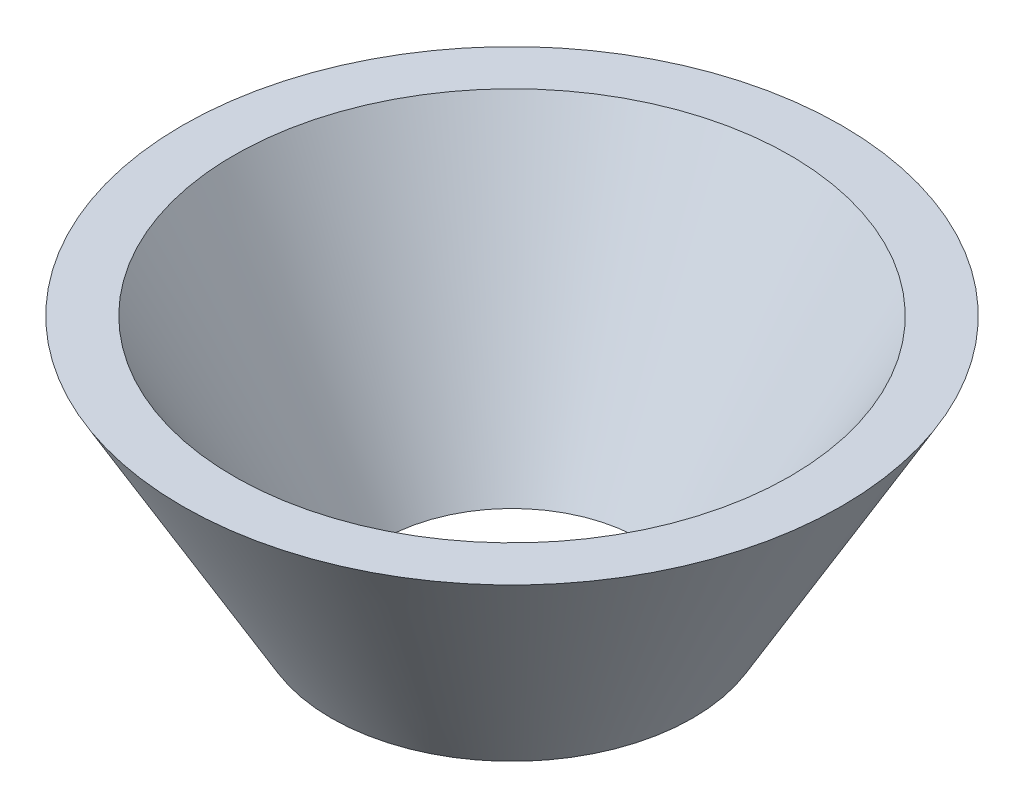
ISO-10303-21;
HEADER;
FILE_DESCRIPTION(('STEP AP214'),'2;1');
FILE_NAME('part.step','',(''),(''),'','','');
FILE_SCHEMA(('AUTOMOTIVE_DESIGN { 1 0 10303 214 1 1 1 1 }'));
ENDSEC;
DATA;
#1=APPLICATION_CONTEXT('core data for automotive mechanical design processes');
#2=APPLICATION_PROTOCOL_DEFINITION('international standard','automotive_design',2000,#1);
#3=PRODUCT_CONTEXT('',#1,'mechanical');
#4=PRODUCT('Part','Part','',(#3));
#5=PRODUCT_RELATED_PRODUCT_CATEGORY('part','',(#4));
#6=PRODUCT_DEFINITION_FORMATION('','',#4);
#7=PRODUCT_DEFINITION_CONTEXT('part definition',#1,'design');
#8=PRODUCT_DEFINITION('design','',#6,#7);
#9=PRODUCT_DEFINITION_SHAPE('','',#8);
#10=(LENGTH_UNIT() NAMED_UNIT(*) SI_UNIT(.MILLI.,.METRE.));
#11=(NAMED_UNIT(*) PLANE_ANGLE_UNIT() SI_UNIT($,.RADIAN.));
#12=(NAMED_UNIT(*) SI_UNIT($,.STERADIAN.) SOLID_ANGLE_UNIT());
#13=UNCERTAINTY_MEASURE_WITH_UNIT(LENGTH_MEASURE(1.E-05),#10,'distance_accuracy_value','');
#14=(GEOMETRIC_REPRESENTATION_CONTEXT(3) GLOBAL_UNCERTAINTY_ASSIGNED_CONTEXT((#13)) GLOBAL_UNIT_ASSIGNED_CONTEXT((#10,
#11,#12)) REPRESENTATION_CONTEXT('',''));
#15=CARTESIAN_POINT('',(0.,0.,0.));
#16=DIRECTION('',(0.,0.,1.));
#17=DIRECTION('',(1.,0.,0.));
#18=AXIS2_PLACEMENT_3D('',#15,#16,#17);
#19=CARTESIAN_POINT('',(-53.8675134594811,50.,0.));
#20=DIRECTION('',(0.,-1.,0.));
#21=DIRECTION('',(1.,0.,0.));
#22=AXIS2_PLACEMENT_3D('',#19,#20,#21);
#23=PLANE('',#22);
#24=CARTESIAN_POINT('',(-1.71454689373137E-13,50.0000000000002,0.));
#25=DIRECTION('',(0.,-1.,0.));
#26=DIRECTION('',(1.,0.,0.));
#27=AXIS2_PLACEMENT_3D('',#24,#25,#26);
#28=CIRCLE('',#27,63.867513459481);
#29=CARTESIAN_POINT('',(63.8675134594808,50.0000000000004,0.));
#30=VERTEX_POINT('',#29);
#31=EDGE_CURVE('E10',#30,#30,#28,.T.);
#32=ORIENTED_EDGE('',*,*,#31,.F.);
#33=EDGE_LOOP('',(#32));
#34=FACE_BOUND('',#33,.T.);
#35=CARTESIAN_POINT('',(-1.71454689373137E-13,50.0000000000002,0.));
#36=DIRECTION('',(0.,-1.,0.));
#37=DIRECTION('',(1.,0.,0.));
#38=AXIS2_PLACEMENT_3D('',#35,#36,#37);
#39=CIRCLE('',#38,53.867513459481);
#40=CARTESIAN_POINT('',(53.8675134594808,50.0000000000004,0.));
#41=VERTEX_POINT('',#40);
#42=EDGE_CURVE('E54',#41,#41,#39,.T.);
#43=ORIENTED_EDGE('',*,*,#42,.T.);
#44=EDGE_LOOP('',(#43));
#45=FACE_BOUND('',#44,.T.);
#46=ADVANCED_FACE('F37',(#34,#45),#23,.F.);
#47=CARTESIAN_POINT('',(-1.71454689373137E-13,50.0000000000002,0.));
#48=DIRECTION('',(0.,1.,0.));
#49=DIRECTION('',(-1.,0.,0.));
#50=AXIS2_PLACEMENT_3D('',#47,#48,#49);
#51=CONICAL_SURFACE('',#50,63.867513459481,0.523598775598293);
#52=CARTESIAN_POINT('',(0.,1.1573201876418E-13,0.));
#53=DIRECTION('',(0.,-1.,0.));
#54=DIRECTION('',(1.,0.,0.));
#55=AXIS2_PLACEMENT_3D('',#52,#53,#54);
#56=CIRCLE('',#55,35.);
#57=CARTESIAN_POINT('',(35.,2.35750301325375E-13,0.));
#58=VERTEX_POINT('',#57);
#59=EDGE_CURVE('E44',#58,#58,#56,.T.);
#60=ORIENTED_EDGE('',*,*,#59,.F.);
#61=EDGE_LOOP('',(#60));
#62=FACE_BOUND('',#61,.T.);
#63=ORIENTED_EDGE('',*,*,#31,.T.);
#64=EDGE_LOOP('',(#63));
#65=FACE_BOUND('',#64,.T.);
#66=ADVANCED_FACE('F70',(#62,#65),#51,.T.);
#67=CARTESIAN_POINT('',(-35.,0.,0.));
#68=DIRECTION('',(0.,1.,0.));
#69=DIRECTION('',(-1.,0.,0.));
#70=AXIS2_PLACEMENT_3D('',#67,#68,#69);
#71=PLANE('',#70);
#72=CARTESIAN_POINT('',(0.,0.,0.));
#73=DIRECTION('',(0.,-1.,0.));
#74=DIRECTION('',(1.,0.,0.));
#75=AXIS2_PLACEMENT_3D('',#72,#73,#74);
#76=CIRCLE('',#75,25.);
#77=CARTESIAN_POINT('',(25.,1.6716842557612E-13,0.));
#78=VERTEX_POINT('',#77);
#79=EDGE_CURVE('E49',#78,#78,#76,.T.);
#80=ORIENTED_EDGE('',*,*,#79,.F.);
#81=EDGE_LOOP('',(#80));
#82=FACE_BOUND('',#81,.T.);
#83=ORIENTED_EDGE('',*,*,#59,.T.);
#84=EDGE_LOOP('',(#83));
#85=FACE_BOUND('',#84,.T.);
#86=ADVANCED_FACE('F65',(#82,#85),#71,.F.);
#87=CARTESIAN_POINT('',(0.,0.,0.));
#88=DIRECTION('',(0.,1.,0.));
#89=DIRECTION('',(-1.,0.,0.));
#90=AXIS2_PLACEMENT_3D('',#87,#88,#89);
#91=CONICAL_SURFACE('',#90,25.,0.523598775598293);
#92=ORIENTED_EDGE('',*,*,#42,.F.);
#93=EDGE_LOOP('',(#92));
#94=FACE_BOUND('',#93,.T.);
#95=ORIENTED_EDGE('',*,*,#79,.T.);
#96=EDGE_LOOP('',(#95));
#97=FACE_BOUND('',#96,.T.);
#98=ADVANCED_FACE('F62',(#94,#97),#91,.F.);
#99=CLOSED_SHELL('',(#46,#66,#86,#98));
#100=MANIFOLD_SOLID_BREP('B2',#99);
#101=ADVANCED_BREP_SHAPE_REPRESENTATION('',(#18,#100),#14);
#102=SHAPE_DEFINITION_REPRESENTATION(#9,#101);
ENDSEC;
END-ISO-10303-21;
